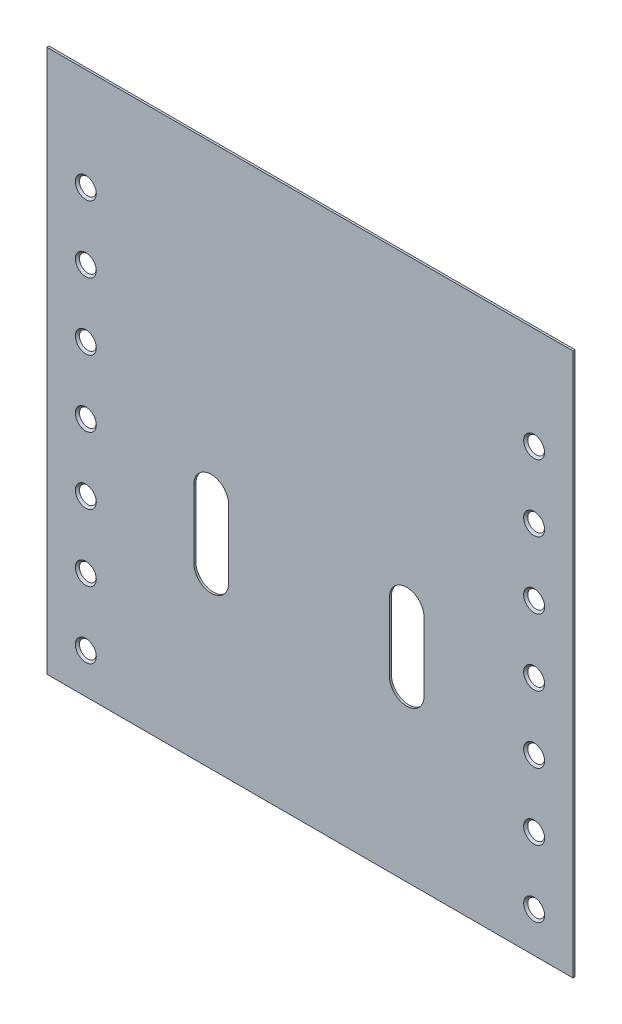
ISO-10303-21;
HEADER;
FILE_DESCRIPTION(('STEP AP214'),'2;1');
FILE_NAME('part.step','',(''),(''),'','','');
FILE_SCHEMA(('AUTOMOTIVE_DESIGN { 1 0 10303 214 1 1 1 1 }'));
ENDSEC;
DATA;
#1=APPLICATION_CONTEXT('core data for automotive mechanical design processes');
#2=APPLICATION_PROTOCOL_DEFINITION('international standard','automotive_design',2000,#1);
#3=PRODUCT_CONTEXT('',#1,'mechanical');
#4=PRODUCT('Part','Part','',(#3));
#5=PRODUCT_RELATED_PRODUCT_CATEGORY('part','',(#4));
#6=PRODUCT_DEFINITION_FORMATION('','',#4);
#7=PRODUCT_DEFINITION_CONTEXT('part definition',#1,'design');
#8=PRODUCT_DEFINITION('design','',#6,#7);
#9=PRODUCT_DEFINITION_SHAPE('','',#8);
#10=(LENGTH_UNIT() NAMED_UNIT(*) SI_UNIT(.MILLI.,.METRE.));
#11=(NAMED_UNIT(*) PLANE_ANGLE_UNIT() SI_UNIT($,.RADIAN.));
#12=(NAMED_UNIT(*) SI_UNIT($,.STERADIAN.) SOLID_ANGLE_UNIT());
#13=UNCERTAINTY_MEASURE_WITH_UNIT(LENGTH_MEASURE(1.E-05),#10,'distance_accuracy_value','');
#14=(GEOMETRIC_REPRESENTATION_CONTEXT(3) GLOBAL_UNCERTAINTY_ASSIGNED_CONTEXT((#13)) GLOBAL_UNIT_ASSIGNED_CONTEXT((#10,
#11,#12)) REPRESENTATION_CONTEXT('',''));
#15=CARTESIAN_POINT('',(0.,0.,0.));
#16=DIRECTION('',(0.,0.,1.));
#17=DIRECTION('',(1.,0.,0.));
#18=AXIS2_PLACEMENT_3D('',#15,#16,#17);
#19=CARTESIAN_POINT('',(0.,0.,-0.7747));
#20=DIRECTION('',(0.,0.,-1.));
#21=DIRECTION('',(-1.,0.,0.));
#22=AXIS2_PLACEMENT_3D('',#19,#20,#21);
#23=PLANE('',#22);
#24=CARTESIAN_POINT('',(-20.9050000000001,-222.,-0.7747));
#25=DIRECTION('',(0.,0.,-1.));
#26=DIRECTION('',(-1.,0.,0.));
#27=AXIS2_PLACEMENT_3D('',#24,#25,#26);
#28=CIRCLE('',#27,3.1373);
#29=CARTESIAN_POINT('',(-24.0423000000001,-222.,-0.7747));
#30=VERTEX_POINT('',#29);
#31=EDGE_CURVE('E38',#30,#30,#28,.T.);
#32=ORIENTED_EDGE('',*,*,#31,.F.);
#33=EDGE_LOOP('',(#32));
#34=FACE_BOUND('',#33,.T.);
#35=CARTESIAN_POINT('',(-20.9050000000003,-147.,-0.7747));
#36=DIRECTION('',(0.,0.,-1.));
#37=DIRECTION('',(-1.,0.,0.));
#38=AXIS2_PLACEMENT_3D('',#35,#36,#37);
#39=CIRCLE('',#38,3.1373);
#40=CARTESIAN_POINT('',(-24.0423000000003,-147.,-0.7747));
#41=VERTEX_POINT('',#40);
#42=EDGE_CURVE('E174',#41,#41,#39,.T.);
#43=ORIENTED_EDGE('',*,*,#42,.F.);
#44=EDGE_LOOP('',(#43));
#45=FACE_BOUND('',#44,.T.);
#46=CARTESIAN_POINT('',(-20.9050000000003,-71.9999999999999,-0.7747));
#47=DIRECTION('',(0.,0.,-1.));
#48=DIRECTION('',(-1.,0.,0.));
#49=AXIS2_PLACEMENT_3D('',#46,#47,#48);
#50=CIRCLE('',#49,3.1373);
#51=CARTESIAN_POINT('',(-24.0423000000003,-71.9999999999999,-0.7747));
#52=VERTEX_POINT('',#51);
#53=EDGE_CURVE('E199',#52,#52,#50,.T.);
#54=ORIENTED_EDGE('',*,*,#53,.F.);
#55=EDGE_LOOP('',(#54));
#56=FACE_BOUND('',#55,.T.);
#57=CARTESIAN_POINT('',(-188.645,-222.,-0.7747));
#58=DIRECTION('',(0.,0.,-1.));
#59=DIRECTION('',(-1.,0.,0.));
#60=AXIS2_PLACEMENT_3D('',#57,#58,#59);
#61=CIRCLE('',#60,3.1373);
#62=CARTESIAN_POINT('',(-191.7823,-222.,-0.7747));
#63=VERTEX_POINT('',#62);
#64=EDGE_CURVE('E205',#63,#63,#61,.T.);
#65=ORIENTED_EDGE('',*,*,#64,.F.);
#66=EDGE_LOOP('',(#65));
#67=FACE_BOUND('',#66,.T.);
#68=CARTESIAN_POINT('',(-188.645,-172.,-0.7747));
#69=DIRECTION('',(0.,0.,-1.));
#70=DIRECTION('',(-1.,0.,0.));
#71=AXIS2_PLACEMENT_3D('',#68,#69,#70);
#72=CIRCLE('',#71,3.1373);
#73=CARTESIAN_POINT('',(-191.7823,-172.,-0.7747));
#74=VERTEX_POINT('',#73);
#75=EDGE_CURVE('E217',#74,#74,#72,.T.);
#76=ORIENTED_EDGE('',*,*,#75,.F.);
#77=EDGE_LOOP('',(#76));
#78=FACE_BOUND('',#77,.T.);
#79=CARTESIAN_POINT('',(-188.645,-122.,-0.7747));
#80=DIRECTION('',(0.,0.,-1.));
#81=DIRECTION('',(-1.,0.,0.));
#82=AXIS2_PLACEMENT_3D('',#79,#80,#81);
#83=CIRCLE('',#82,3.1373);
#84=CARTESIAN_POINT('',(-191.7823,-122.,-0.7747));
#85=VERTEX_POINT('',#84);
#86=EDGE_CURVE('E229',#85,#85,#83,.T.);
#87=ORIENTED_EDGE('',*,*,#86,.F.);
#88=EDGE_LOOP('',(#87));
#89=FACE_BOUND('',#88,.T.);
#90=CARTESIAN_POINT('',(-188.645,-72.,-0.7747));
#91=DIRECTION('',(0.,0.,-1.));
#92=DIRECTION('',(-1.,0.,0.));
#93=AXIS2_PLACEMENT_3D('',#90,#91,#92);
#94=CIRCLE('',#93,3.1373);
#95=CARTESIAN_POINT('',(-191.7823,-72.,-0.7747));
#96=VERTEX_POINT('',#95);
#97=EDGE_CURVE('E143',#96,#96,#94,.T.);
#98=ORIENTED_EDGE('',*,*,#97,.F.);
#99=EDGE_LOOP('',(#98));
#100=FACE_BOUND('',#99,.T.);
#101=CARTESIAN_POINT('',(-68.5692532358968,-173.5,-0.774699999999979));
#102=DIRECTION('',(0.,0.,-1.));
#103=DIRECTION('',(0.,1.,0.));
#104=AXIS2_PLACEMENT_3D('',#101,#102,#103);
#105=CIRCLE('',#104,6.5);
#106=CARTESIAN_POINT('',(-62.0692532358968,-173.5,-0.774699999999979));
#107=VERTEX_POINT('',#106);
#108=CARTESIAN_POINT('',(-75.0692532358968,-173.5,-0.7747));
#109=VERTEX_POINT('',#108);
#110=EDGE_CURVE('E59',#107,#109,#105,.T.);
#111=ORIENTED_EDGE('',*,*,#110,.F.);
#112=DIRECTION('',(0.,-1.,0.));
#113=VECTOR('',#112,1.);
#114=CARTESIAN_POINT('',(-62.0692532358968,-173.5,-0.774699999999979));
#115=LINE('',#114,#113);
#116=CARTESIAN_POINT('',(-62.0692532358968,-148.,-0.774699999999982));
#117=VERTEX_POINT('',#116);
#118=EDGE_CURVE('E274',#117,#107,#115,.T.);
#119=ORIENTED_EDGE('',*,*,#118,.F.);
#120=CARTESIAN_POINT('',(-68.5692532358968,-148.,-0.774699999999982));
#121=DIRECTION('',(0.,0.,-1.));
#122=DIRECTION('',(0.,1.,0.));
#123=AXIS2_PLACEMENT_3D('',#120,#121,#122);
#124=CIRCLE('',#123,6.5);
#125=CARTESIAN_POINT('',(-75.0692532358968,-148.,-0.774699999999982));
#126=VERTEX_POINT('',#125);
#127=EDGE_CURVE('E288',#126,#117,#124,.T.);
#128=ORIENTED_EDGE('',*,*,#127,.F.);
#129=DIRECTION('',(0.,1.,0.));
#130=VECTOR('',#129,1.);
#131=CARTESIAN_POINT('',(-75.0692532358968,-173.5,-0.774699999999979));
#132=LINE('',#131,#130);
#133=EDGE_CURVE('E285',#109,#126,#132,.T.);
#134=ORIENTED_EDGE('',*,*,#133,.F.);
#135=EDGE_LOOP('',(#111,#119,#128,#134));
#136=FACE_BOUND('',#135,.T.);
#137=CARTESIAN_POINT('',(-141.721253235897,-173.5,-0.774699999999979));
#138=DIRECTION('',(0.,0.,-1.));
#139=DIRECTION('',(0.,1.,0.));
#140=AXIS2_PLACEMENT_3D('',#137,#138,#139);
#141=CIRCLE('',#140,6.49999999999995);
#142=CARTESIAN_POINT('',(-135.221253235897,-173.5,-0.774699999999979));
#143=VERTEX_POINT('',#142);
#144=CARTESIAN_POINT('',(-148.221253235897,-173.5,-0.7747));
#145=VERTEX_POINT('',#144);
#146=EDGE_CURVE('E51',#143,#145,#141,.T.);
#147=ORIENTED_EDGE('',*,*,#146,.F.);
#148=DIRECTION('',(0.,-1.,0.));
#149=VECTOR('',#148,1.);
#150=CARTESIAN_POINT('',(-135.221253235897,-173.5,-0.774699999999979));
#151=LINE('',#150,#149);
#152=CARTESIAN_POINT('',(-135.221253235897,-148.,-0.774699999999982));
#153=VERTEX_POINT('',#152);
#154=EDGE_CURVE('E244',#153,#143,#151,.T.);
#155=ORIENTED_EDGE('',*,*,#154,.F.);
#156=CARTESIAN_POINT('',(-141.721253235897,-148.,-0.774699999999982));
#157=DIRECTION('',(0.,0.,-1.));
#158=DIRECTION('',(0.,1.,0.));
#159=AXIS2_PLACEMENT_3D('',#156,#157,#158);
#160=CIRCLE('',#159,6.49999999999995);
#161=CARTESIAN_POINT('',(-148.221253235897,-148.,-0.774699999999982));
#162=VERTEX_POINT('',#161);
#163=EDGE_CURVE('E259',#162,#153,#160,.T.);
#164=ORIENTED_EDGE('',*,*,#163,.F.);
#165=DIRECTION('',(0.,1.,0.));
#166=VECTOR('',#165,1.);
#167=CARTESIAN_POINT('',(-148.221253235897,-173.5,-0.774699999999979));
#168=LINE('',#167,#166);
#169=EDGE_CURVE('E255',#145,#162,#168,.T.);
#170=ORIENTED_EDGE('',*,*,#169,.F.);
#171=EDGE_LOOP('',(#147,#155,#164,#170));
#172=FACE_BOUND('',#171,.T.);
#173=DIRECTION('',(0.,1.,0.));
#174=VECTOR('',#173,1.);
#175=CARTESIAN_POINT('',(-203.2,-237.,-0.7747));
#176=LINE('',#175,#174);
#177=CARTESIAN_POINT('',(-203.2,-237.,-0.7747));
#178=VERTEX_POINT('',#177);
#179=CARTESIAN_POINT('',(-203.2,-33.7999999999999,-0.7747));
#180=VERTEX_POINT('',#179);
#181=EDGE_CURVE('E151',#178,#180,#176,.T.);
#182=ORIENTED_EDGE('',*,*,#181,.T.);
#183=DIRECTION('',(1.,0.,0.));
#184=VECTOR('',#183,1.);
#185=CARTESIAN_POINT('',(-203.2,-33.7999999999999,-0.7747));
#186=LINE('',#185,#184);
#187=CARTESIAN_POINT('',(-6.35000000000006,-33.8,-0.7747));
#188=VERTEX_POINT('',#187);
#189=EDGE_CURVE('E147',#180,#188,#186,.T.);
#190=ORIENTED_EDGE('',*,*,#189,.T.);
#191=DIRECTION('',(0.,-1.,0.));
#192=VECTOR('',#191,1.);
#193=CARTESIAN_POINT('',(-6.35000000000001,-237.,-0.7747));
#194=LINE('',#193,#192);
#195=CARTESIAN_POINT('',(-6.35000000000001,-237.,-0.7747));
#196=VERTEX_POINT('',#195);
#197=EDGE_CURVE('E150',#188,#196,#194,.T.);
#198=ORIENTED_EDGE('',*,*,#197,.T.);
#199=DIRECTION('',(-1.,0.,0.));
#200=VECTOR('',#199,1.);
#201=CARTESIAN_POINT('',(-203.2,-237.,-0.7747));
#202=LINE('',#201,#200);
#203=EDGE_CURVE('E153',#196,#178,#202,.T.);
#204=ORIENTED_EDGE('',*,*,#203,.T.);
#205=EDGE_LOOP('',(#182,#190,#198,#204));
#206=FACE_BOUND('',#205,.T.);
#207=CARTESIAN_POINT('',(-188.645,-96.9999999999999,-0.7747));
#208=DIRECTION('',(0.,0.,-1.));
#209=DIRECTION('',(-1.,0.,0.));
#210=AXIS2_PLACEMENT_3D('',#207,#208,#209);
#211=CIRCLE('',#210,3.1373);
#212=CARTESIAN_POINT('',(-191.7823,-96.9999999999999,-0.7747));
#213=VERTEX_POINT('',#212);
#214=EDGE_CURVE('E235',#213,#213,#211,.T.);
#215=ORIENTED_EDGE('',*,*,#214,.F.);
#216=EDGE_LOOP('',(#215));
#217=FACE_BOUND('',#216,.T.);
#218=CARTESIAN_POINT('',(-188.645,-147.,-0.7747));
#219=DIRECTION('',(0.,0.,-1.));
#220=DIRECTION('',(-1.,0.,0.));
#221=AXIS2_PLACEMENT_3D('',#218,#219,#220);
#222=CIRCLE('',#221,3.1373);
#223=CARTESIAN_POINT('',(-191.7823,-147.,-0.7747));
#224=VERTEX_POINT('',#223);
#225=EDGE_CURVE('E223',#224,#224,#222,.T.);
#226=ORIENTED_EDGE('',*,*,#225,.F.);
#227=EDGE_LOOP('',(#226));
#228=FACE_BOUND('',#227,.T.);
#229=CARTESIAN_POINT('',(-188.645,-197.,-0.7747));
#230=DIRECTION('',(0.,0.,-1.));
#231=DIRECTION('',(-1.,0.,0.));
#232=AXIS2_PLACEMENT_3D('',#229,#230,#231);
#233=CIRCLE('',#232,3.1373);
#234=CARTESIAN_POINT('',(-191.7823,-197.,-0.7747));
#235=VERTEX_POINT('',#234);
#236=EDGE_CURVE('E211',#235,#235,#233,.T.);
#237=ORIENTED_EDGE('',*,*,#236,.F.);
#238=EDGE_LOOP('',(#237));
#239=FACE_BOUND('',#238,.T.);
#240=CARTESIAN_POINT('',(-20.9050000000003,-96.9999999999999,-0.7747));
#241=DIRECTION('',(0.,0.,-1.));
#242=DIRECTION('',(-1.,0.,0.));
#243=AXIS2_PLACEMENT_3D('',#240,#241,#242);
#244=CIRCLE('',#243,3.1373);
#245=CARTESIAN_POINT('',(-24.0423000000003,-96.9999999999999,-0.7747));
#246=VERTEX_POINT('',#245);
#247=EDGE_CURVE('E170',#246,#246,#244,.T.);
#248=ORIENTED_EDGE('',*,*,#247,.F.);
#249=EDGE_LOOP('',(#248));
#250=FACE_BOUND('',#249,.T.);
#251=CARTESIAN_POINT('',(-20.9050000000003,-122.,-0.7747));
#252=DIRECTION('',(0.,0.,-1.));
#253=DIRECTION('',(-1.,0.,0.));
#254=AXIS2_PLACEMENT_3D('',#251,#252,#253);
#255=CIRCLE('',#254,3.1373);
#256=CARTESIAN_POINT('',(-24.0423000000003,-122.,-0.7747));
#257=VERTEX_POINT('',#256);
#258=EDGE_CURVE('E181',#257,#257,#255,.T.);
#259=ORIENTED_EDGE('',*,*,#258,.F.);
#260=EDGE_LOOP('',(#259));
#261=FACE_BOUND('',#260,.T.);
#262=CARTESIAN_POINT('',(-20.9050000000003,-172.,-0.7747));
#263=DIRECTION('',(0.,0.,-1.));
#264=DIRECTION('',(-1.,0.,0.));
#265=AXIS2_PLACEMENT_3D('',#262,#263,#264);
#266=CIRCLE('',#265,3.1373);
#267=CARTESIAN_POINT('',(-24.0423000000003,-172.,-0.7747));
#268=VERTEX_POINT('',#267);
#269=EDGE_CURVE('E184',#268,#268,#266,.T.);
#270=ORIENTED_EDGE('',*,*,#269,.F.);
#271=EDGE_LOOP('',(#270));
#272=FACE_BOUND('',#271,.T.);
#273=CARTESIAN_POINT('',(-20.9050000000003,-197.,-0.7747));
#274=DIRECTION('',(0.,0.,-1.));
#275=DIRECTION('',(-1.,0.,0.));
#276=AXIS2_PLACEMENT_3D('',#273,#274,#275);
#277=CIRCLE('',#276,3.1373);
#278=CARTESIAN_POINT('',(-24.0423000000003,-197.,-0.7747));
#279=VERTEX_POINT('',#278);
#280=EDGE_CURVE('E613',#279,#279,#277,.T.);
#281=ORIENTED_EDGE('',*,*,#280,.F.);
#282=EDGE_LOOP('',(#281));
#283=FACE_BOUND('',#282,.T.);
#284=ADVANCED_FACE('F34',(#34,#45,#56,#67,#78,#89,#100,#136,#172,#206,#217,#228,#239,#250,#261,
#272,#283),#23,.T.);
#285=CARTESIAN_POINT('',(0.,0.,0.));
#286=DIRECTION('',(0.,0.,-1.));
#287=DIRECTION('',(-1.,0.,0.));
#288=AXIS2_PLACEMENT_3D('',#285,#286,#287);
#289=PLANE('',#288);
#290=CARTESIAN_POINT('',(-20.9050000000001,-222.,0.));
#291=DIRECTION('',(0.,0.,1.));
#292=DIRECTION('',(1.,0.,0.));
#293=AXIS2_PLACEMENT_3D('',#290,#291,#292);
#294=CIRCLE('',#293,3.912);
#295=CARTESIAN_POINT('',(-16.9930000000001,-222.,0.));
#296=VERTEX_POINT('',#295);
#297=EDGE_CURVE('E620',#296,#296,#294,.T.);
#298=ORIENTED_EDGE('',*,*,#297,.F.);
#299=EDGE_LOOP('',(#298));
#300=FACE_BOUND('',#299,.T.);
#301=CARTESIAN_POINT('',(-20.9050000000003,-147.,0.));
#302=DIRECTION('',(0.,0.,1.));
#303=DIRECTION('',(1.,0.,0.));
#304=AXIS2_PLACEMENT_3D('',#301,#302,#303);
#305=CIRCLE('',#304,3.912);
#306=CARTESIAN_POINT('',(-16.9930000000003,-147.,0.));
#307=VERTEX_POINT('',#306);
#308=EDGE_CURVE('E177',#307,#307,#305,.T.);
#309=ORIENTED_EDGE('',*,*,#308,.F.);
#310=EDGE_LOOP('',(#309));
#311=FACE_BOUND('',#310,.T.);
#312=CARTESIAN_POINT('',(-20.9050000000003,-96.9999999999999,0.));
#313=DIRECTION('',(0.,0.,1.));
#314=DIRECTION('',(1.,0.,0.));
#315=AXIS2_PLACEMENT_3D('',#312,#313,#314);
#316=CIRCLE('',#315,3.912);
#317=CARTESIAN_POINT('',(-16.9930000000003,-96.9999999999999,0.));
#318=VERTEX_POINT('',#317);
#319=EDGE_CURVE('E173',#318,#318,#316,.T.);
#320=ORIENTED_EDGE('',*,*,#319,.F.);
#321=EDGE_LOOP('',(#320));
#322=FACE_BOUND('',#321,.T.);
#323=CARTESIAN_POINT('',(-188.645,-222.,0.));
#324=DIRECTION('',(0.,0.,1.));
#325=DIRECTION('',(1.,0.,0.));
#326=AXIS2_PLACEMENT_3D('',#323,#324,#325);
#327=CIRCLE('',#326,3.912);
#328=CARTESIAN_POINT('',(-184.733,-222.,0.));
#329=VERTEX_POINT('',#328);
#330=EDGE_CURVE('E202',#329,#329,#327,.T.);
#331=ORIENTED_EDGE('',*,*,#330,.F.);
#332=EDGE_LOOP('',(#331));
#333=FACE_BOUND('',#332,.T.);
#334=CARTESIAN_POINT('',(-188.645,-197.,0.));
#335=DIRECTION('',(0.,0.,1.));
#336=DIRECTION('',(1.,0.,0.));
#337=AXIS2_PLACEMENT_3D('',#334,#335,#336);
#338=CIRCLE('',#337,3.912);
#339=CARTESIAN_POINT('',(-184.733,-197.,0.));
#340=VERTEX_POINT('',#339);
#341=EDGE_CURVE('E208',#340,#340,#338,.T.);
#342=ORIENTED_EDGE('',*,*,#341,.F.);
#343=EDGE_LOOP('',(#342));
#344=FACE_BOUND('',#343,.T.);
#345=CARTESIAN_POINT('',(-188.645,-172.,0.));
#346=DIRECTION('',(0.,0.,1.));
#347=DIRECTION('',(1.,0.,0.));
#348=AXIS2_PLACEMENT_3D('',#345,#346,#347);
#349=CIRCLE('',#348,3.912);
#350=CARTESIAN_POINT('',(-184.733,-172.,0.));
#351=VERTEX_POINT('',#350);
#352=EDGE_CURVE('E214',#351,#351,#349,.T.);
#353=ORIENTED_EDGE('',*,*,#352,.F.);
#354=EDGE_LOOP('',(#353));
#355=FACE_BOUND('',#354,.T.);
#356=CARTESIAN_POINT('',(-188.645,-147.,0.));
#357=DIRECTION('',(0.,0.,1.));
#358=DIRECTION('',(1.,0.,0.));
#359=AXIS2_PLACEMENT_3D('',#356,#357,#358);
#360=CIRCLE('',#359,3.912);
#361=CARTESIAN_POINT('',(-184.733,-147.,0.));
#362=VERTEX_POINT('',#361);
#363=EDGE_CURVE('E220',#362,#362,#360,.T.);
#364=ORIENTED_EDGE('',*,*,#363,.F.);
#365=EDGE_LOOP('',(#364));
#366=FACE_BOUND('',#365,.T.);
#367=CARTESIAN_POINT('',(-188.645,-122.,0.));
#368=DIRECTION('',(0.,0.,1.));
#369=DIRECTION('',(1.,0.,0.));
#370=AXIS2_PLACEMENT_3D('',#367,#368,#369);
#371=CIRCLE('',#370,3.912);
#372=CARTESIAN_POINT('',(-184.733,-122.,0.));
#373=VERTEX_POINT('',#372);
#374=EDGE_CURVE('E226',#373,#373,#371,.T.);
#375=ORIENTED_EDGE('',*,*,#374,.F.);
#376=EDGE_LOOP('',(#375));
#377=FACE_BOUND('',#376,.T.);
#378=CARTESIAN_POINT('',(-188.645,-96.9999999999999,0.));
#379=DIRECTION('',(0.,0.,1.));
#380=DIRECTION('',(1.,0.,0.));
#381=AXIS2_PLACEMENT_3D('',#378,#379,#380);
#382=CIRCLE('',#381,3.912);
#383=CARTESIAN_POINT('',(-184.733,-96.9999999999999,0.));
#384=VERTEX_POINT('',#383);
#385=EDGE_CURVE('E232',#384,#384,#382,.T.);
#386=ORIENTED_EDGE('',*,*,#385,.F.);
#387=EDGE_LOOP('',(#386));
#388=FACE_BOUND('',#387,.T.);
#389=CARTESIAN_POINT('',(-188.645,-72.,0.));
#390=DIRECTION('',(0.,0.,1.));
#391=DIRECTION('',(1.,0.,0.));
#392=AXIS2_PLACEMENT_3D('',#389,#390,#391);
#393=CIRCLE('',#392,3.912);
#394=CARTESIAN_POINT('',(-184.733,-72.,0.));
#395=VERTEX_POINT('',#394);
#396=EDGE_CURVE('E169',#395,#395,#393,.T.);
#397=ORIENTED_EDGE('',*,*,#396,.F.);
#398=EDGE_LOOP('',(#397));
#399=FACE_BOUND('',#398,.T.);
#400=DIRECTION('',(0.,-1.,0.));
#401=VECTOR('',#400,1.);
#402=CARTESIAN_POINT('',(-62.0692532358968,-173.5,0.));
#403=LINE('',#402,#401);
#404=CARTESIAN_POINT('',(-62.0692532358968,-148.,0.));
#405=VERTEX_POINT('',#404);
#406=CARTESIAN_POINT('',(-62.0692532358968,-173.5,0.));
#407=VERTEX_POINT('',#406);
#408=EDGE_CURVE('E280',#405,#407,#403,.T.);
#409=ORIENTED_EDGE('',*,*,#408,.T.);
#410=CARTESIAN_POINT('',(-68.5692532358968,-173.5,0.));
#411=DIRECTION('',(0.,0.,-1.));
#412=DIRECTION('',(0.,1.,0.));
#413=AXIS2_PLACEMENT_3D('',#410,#411,#412);
#414=CIRCLE('',#413,6.5);
#415=CARTESIAN_POINT('',(-75.0692532358968,-173.5,0.));
#416=VERTEX_POINT('',#415);
#417=EDGE_CURVE('E270',#407,#416,#414,.T.);
#418=ORIENTED_EDGE('',*,*,#417,.T.);
#419=DIRECTION('',(0.,1.,0.));
#420=VECTOR('',#419,1.);
#421=CARTESIAN_POINT('',(-75.0692532358968,-173.5,0.));
#422=LINE('',#421,#420);
#423=CARTESIAN_POINT('',(-75.0692532358968,-148.,0.));
#424=VERTEX_POINT('',#423);
#425=EDGE_CURVE('E273',#416,#424,#422,.T.);
#426=ORIENTED_EDGE('',*,*,#425,.T.);
#427=CARTESIAN_POINT('',(-68.5692532358968,-148.,0.));
#428=DIRECTION('',(0.,0.,-1.));
#429=DIRECTION('',(0.,1.,0.));
#430=AXIS2_PLACEMENT_3D('',#427,#428,#429);
#431=CIRCLE('',#430,6.5);
#432=EDGE_CURVE('E277',#424,#405,#431,.T.);
#433=ORIENTED_EDGE('',*,*,#432,.T.);
#434=EDGE_LOOP('',(#409,#418,#426,#433));
#435=FACE_BOUND('',#434,.T.);
#436=DIRECTION('',(0.,-1.,0.));
#437=VECTOR('',#436,1.);
#438=CARTESIAN_POINT('',(-135.221253235897,-173.5,0.));
#439=LINE('',#438,#437);
#440=CARTESIAN_POINT('',(-135.221253235897,-148.,0.));
#441=VERTEX_POINT('',#440);
#442=CARTESIAN_POINT('',(-135.221253235897,-173.5,0.));
#443=VERTEX_POINT('',#442);
#444=EDGE_CURVE('E250',#441,#443,#439,.T.);
#445=ORIENTED_EDGE('',*,*,#444,.T.);
#446=CARTESIAN_POINT('',(-141.721253235897,-173.5,0.));
#447=DIRECTION('',(0.,0.,-1.));
#448=DIRECTION('',(0.,1.,0.));
#449=AXIS2_PLACEMENT_3D('',#446,#447,#448);
#450=CIRCLE('',#449,6.49999999999995);
#451=CARTESIAN_POINT('',(-148.221253235897,-173.5,0.));
#452=VERTEX_POINT('',#451);
#453=EDGE_CURVE('E240',#443,#452,#450,.T.);
#454=ORIENTED_EDGE('',*,*,#453,.T.);
#455=DIRECTION('',(0.,1.,0.));
#456=VECTOR('',#455,1.);
#457=CARTESIAN_POINT('',(-148.221253235897,-173.5,0.));
#458=LINE('',#457,#456);
#459=CARTESIAN_POINT('',(-148.221253235897,-148.,0.));
#460=VERTEX_POINT('',#459);
#461=EDGE_CURVE('E243',#452,#460,#458,.T.);
#462=ORIENTED_EDGE('',*,*,#461,.T.);
#463=CARTESIAN_POINT('',(-141.721253235897,-148.,0.));
#464=DIRECTION('',(0.,0.,-1.));
#465=DIRECTION('',(0.,1.,0.));
#466=AXIS2_PLACEMENT_3D('',#463,#464,#465);
#467=CIRCLE('',#466,6.49999999999995);
#468=EDGE_CURVE('E247',#460,#441,#467,.T.);
#469=ORIENTED_EDGE('',*,*,#468,.T.);
#470=EDGE_LOOP('',(#445,#454,#462,#469));
#471=FACE_BOUND('',#470,.T.);
#472=DIRECTION('',(-1.,0.,0.));
#473=VECTOR('',#472,1.);
#474=CARTESIAN_POINT('',(-203.2,-237.,0.));
#475=LINE('',#474,#473);
#476=CARTESIAN_POINT('',(-6.35000000000001,-237.,0.));
#477=VERTEX_POINT('',#476);
#478=CARTESIAN_POINT('',(-203.2,-237.,0.));
#479=VERTEX_POINT('',#478);
#480=EDGE_CURVE('E155',#477,#479,#475,.T.);
#481=ORIENTED_EDGE('',*,*,#480,.F.);
#482=DIRECTION('',(0.,-1.,0.));
#483=VECTOR('',#482,1.);
#484=CARTESIAN_POINT('',(-6.35000000000001,-237.,0.));
#485=LINE('',#484,#483);
#486=CARTESIAN_POINT('',(-6.35000000000006,-33.7999999999999,0.));
#487=VERTEX_POINT('',#486);
#488=EDGE_CURVE('E133',#487,#477,#485,.T.);
#489=ORIENTED_EDGE('',*,*,#488,.F.);
#490=DIRECTION('',(-1.,0.,0.));
#491=VECTOR('',#490,1.);
#492=CARTESIAN_POINT('',(-6.35000000000006,-33.7999999999999,0.));
#493=LINE('',#492,#491);
#494=CARTESIAN_POINT('',(-203.2,-33.8,0.));
#495=VERTEX_POINT('',#494);
#496=EDGE_CURVE('E137',#487,#495,#493,.T.);
#497=ORIENTED_EDGE('',*,*,#496,.T.);
#498=DIRECTION('',(0.,1.,0.));
#499=VECTOR('',#498,1.);
#500=CARTESIAN_POINT('',(-203.2,-237.,0.));
#501=LINE('',#500,#499);
#502=EDGE_CURVE('E126',#479,#495,#501,.T.);
#503=ORIENTED_EDGE('',*,*,#502,.F.);
#504=EDGE_LOOP('',(#481,#489,#497,#503));
#505=FACE_BOUND('',#504,.T.);
#506=CARTESIAN_POINT('',(-20.9050000000003,-71.9999999999999,0.));
#507=DIRECTION('',(0.,0.,1.));
#508=DIRECTION('',(1.,0.,0.));
#509=AXIS2_PLACEMENT_3D('',#506,#507,#508);
#510=CIRCLE('',#509,3.912);
#511=CARTESIAN_POINT('',(-16.9930000000003,-71.9999999999999,0.));
#512=VERTEX_POINT('',#511);
#513=EDGE_CURVE('E172',#512,#512,#510,.T.);
#514=ORIENTED_EDGE('',*,*,#513,.F.);
#515=EDGE_LOOP('',(#514));
#516=FACE_BOUND('',#515,.T.);
#517=CARTESIAN_POINT('',(-20.9050000000003,-122.,0.));
#518=DIRECTION('',(0.,0.,1.));
#519=DIRECTION('',(1.,0.,0.));
#520=AXIS2_PLACEMENT_3D('',#517,#518,#519);
#521=CIRCLE('',#520,3.912);
#522=CARTESIAN_POINT('',(-16.9930000000003,-122.,0.));
#523=VERTEX_POINT('',#522);
#524=EDGE_CURVE('E176',#523,#523,#521,.T.);
#525=ORIENTED_EDGE('',*,*,#524,.F.);
#526=EDGE_LOOP('',(#525));
#527=FACE_BOUND('',#526,.T.);
#528=CARTESIAN_POINT('',(-20.9050000000003,-172.,0.));
#529=DIRECTION('',(0.,0.,1.));
#530=DIRECTION('',(1.,0.,0.));
#531=AXIS2_PLACEMENT_3D('',#528,#529,#530);
#532=CIRCLE('',#531,3.912);
#533=CARTESIAN_POINT('',(-16.9930000000003,-172.,0.));
#534=VERTEX_POINT('',#533);
#535=EDGE_CURVE('E189',#534,#534,#532,.T.);
#536=ORIENTED_EDGE('',*,*,#535,.F.);
#537=EDGE_LOOP('',(#536));
#538=FACE_BOUND('',#537,.T.);
#539=CARTESIAN_POINT('',(-20.9050000000003,-197.,0.));
#540=DIRECTION('',(0.,0.,1.));
#541=DIRECTION('',(1.,0.,0.));
#542=AXIS2_PLACEMENT_3D('',#539,#540,#541);
#543=CIRCLE('',#542,3.912);
#544=CARTESIAN_POINT('',(-16.9930000000003,-197.,0.));
#545=VERTEX_POINT('',#544);
#546=EDGE_CURVE('E614',#545,#545,#543,.T.);
#547=ORIENTED_EDGE('',*,*,#546,.F.);
#548=EDGE_LOOP('',(#547));
#549=FACE_BOUND('',#548,.T.);
#550=ADVANCED_FACE('F138',(#300,#311,#322,#333,#344,#355,#366,#377,#388,#399,#435,#471,#505,
#516,#527,#538,#549),#289,.F.);
#551=CARTESIAN_POINT('',(-203.2,-237.,-0.7747));
#552=DIRECTION('',(1.,0.,0.));
#553=DIRECTION('',(0.,1.,0.));
#554=AXIS2_PLACEMENT_3D('',#551,#552,#553);
#555=PLANE('',#554);
#556=ORIENTED_EDGE('',*,*,#502,.T.);
#557=DIRECTION('',(0.,0.,1.));
#558=VECTOR('',#557,1.);
#559=CARTESIAN_POINT('',(-203.2,-33.7999999999999,-0.7747));
#560=LINE('',#559,#558);
#561=EDGE_CURVE('E11',#180,#495,#560,.T.);
#562=ORIENTED_EDGE('',*,*,#561,.F.);
#563=ORIENTED_EDGE('',*,*,#181,.F.);
#564=DIRECTION('',(0.,0.,1.));
#565=VECTOR('',#564,1.);
#566=CARTESIAN_POINT('',(-203.2,-237.,-0.7747));
#567=LINE('',#566,#565);
#568=EDGE_CURVE('E130',#178,#479,#567,.T.);
#569=ORIENTED_EDGE('',*,*,#568,.T.);
#570=EDGE_LOOP('',(#556,#562,#563,#569));
#571=FACE_BOUND('',#570,.T.);
#572=ADVANCED_FACE('F36',(#571),#555,.F.);
#573=CARTESIAN_POINT('',(-203.2,-33.7999999999999,-0.7747));
#574=DIRECTION('',(0.,-1.,0.));
#575=DIRECTION('',(1.,0.,0.));
#576=AXIS2_PLACEMENT_3D('',#573,#574,#575);
#577=PLANE('',#576);
#578=ORIENTED_EDGE('',*,*,#561,.T.);
#579=ORIENTED_EDGE('',*,*,#496,.F.);
#580=DIRECTION('',(0.,0.,1.));
#581=VECTOR('',#580,1.);
#582=CARTESIAN_POINT('',(-6.35000000000006,-33.8,-0.7747));
#583=LINE('',#582,#581);
#584=EDGE_CURVE('E43',#188,#487,#583,.T.);
#585=ORIENTED_EDGE('',*,*,#584,.F.);
#586=ORIENTED_EDGE('',*,*,#189,.F.);
#587=EDGE_LOOP('',(#578,#579,#585,#586));
#588=FACE_BOUND('',#587,.T.);
#589=ADVANCED_FACE('F146',(#588),#577,.F.);
#590=CARTESIAN_POINT('',(-6.35000000000001,-237.,-0.7747));
#591=DIRECTION('',(-1.,0.,0.));
#592=DIRECTION('',(0.,-1.,0.));
#593=AXIS2_PLACEMENT_3D('',#590,#591,#592);
#594=PLANE('',#593);
#595=ORIENTED_EDGE('',*,*,#584,.T.);
#596=ORIENTED_EDGE('',*,*,#488,.T.);
#597=DIRECTION('',(0.,0.,1.));
#598=VECTOR('',#597,1.);
#599=CARTESIAN_POINT('',(-6.35000000000001,-237.,-0.7747));
#600=LINE('',#599,#598);
#601=EDGE_CURVE('E163',#196,#477,#600,.T.);
#602=ORIENTED_EDGE('',*,*,#601,.F.);
#603=ORIENTED_EDGE('',*,*,#197,.F.);
#604=EDGE_LOOP('',(#595,#596,#602,#603));
#605=FACE_BOUND('',#604,.T.);
#606=ADVANCED_FACE('F339',(#605),#594,.F.);
#607=CARTESIAN_POINT('',(-203.2,-237.,-0.7747));
#608=DIRECTION('',(0.,1.,0.));
#609=DIRECTION('',(0.,0.,1.));
#610=AXIS2_PLACEMENT_3D('',#607,#608,#609);
#611=PLANE('',#610);
#612=ORIENTED_EDGE('',*,*,#480,.T.);
#613=ORIENTED_EDGE('',*,*,#568,.F.);
#614=ORIENTED_EDGE('',*,*,#203,.F.);
#615=ORIENTED_EDGE('',*,*,#601,.T.);
#616=EDGE_LOOP('',(#612,#613,#614,#615));
#617=FACE_BOUND('',#616,.T.);
#618=ADVANCED_FACE('F322',(#617),#611,.F.);
#619=CARTESIAN_POINT('',(-68.5692532358968,-173.5,0.));
#620=DIRECTION('',(0.,0.,-1.));
#621=DIRECTION('',(0.,1.,0.));
#622=AXIS2_PLACEMENT_3D('',#619,#620,#621);
#623=CYLINDRICAL_SURFACE('',#622,6.5);
#624=ORIENTED_EDGE('',*,*,#110,.T.);
#625=DIRECTION('',(0.,0.,-1.));
#626=VECTOR('',#625,1.);
#627=CARTESIAN_POINT('',(-75.0692532358968,-173.5,0.));
#628=LINE('',#627,#626);
#629=EDGE_CURVE('E283',#416,#109,#628,.T.);
#630=ORIENTED_EDGE('',*,*,#629,.F.);
#631=ORIENTED_EDGE('',*,*,#417,.F.);
#632=DIRECTION('',(0.,0.,-1.));
#633=VECTOR('',#632,1.);
#634=CARTESIAN_POINT('',(-62.0692532358968,-173.5,0.));
#635=LINE('',#634,#633);
#636=EDGE_CURVE('E256',#407,#107,#635,.T.);
#637=ORIENTED_EDGE('',*,*,#636,.T.);
#638=EDGE_LOOP('',(#624,#630,#631,#637));
#639=FACE_BOUND('',#638,.T.);
#640=ADVANCED_FACE('F312',(#639),#623,.F.);
#641=CARTESIAN_POINT('',(-62.0692532358968,-173.5,0.));
#642=DIRECTION('',(1.,0.,0.));
#643=DIRECTION('',(0.,1.,0.));
#644=AXIS2_PLACEMENT_3D('',#641,#642,#643);
#645=PLANE('',#644);
#646=ORIENTED_EDGE('',*,*,#118,.T.);
#647=ORIENTED_EDGE('',*,*,#636,.F.);
#648=ORIENTED_EDGE('',*,*,#408,.F.);
#649=DIRECTION('',(0.,0.,-1.));
#650=VECTOR('',#649,1.);
#651=CARTESIAN_POINT('',(-62.0692532358968,-148.,0.));
#652=LINE('',#651,#650);
#653=EDGE_CURVE('E294',#405,#117,#652,.T.);
#654=ORIENTED_EDGE('',*,*,#653,.T.);
#655=EDGE_LOOP('',(#646,#647,#648,#654));
#656=FACE_BOUND('',#655,.T.);
#657=ADVANCED_FACE('F314',(#656),#645,.F.);
#658=CARTESIAN_POINT('',(-68.5692532358968,-148.,0.));
#659=DIRECTION('',(0.,0.,-1.));
#660=DIRECTION('',(0.,1.,0.));
#661=AXIS2_PLACEMENT_3D('',#658,#659,#660);
#662=CYLINDRICAL_SURFACE('',#661,6.5);
#663=ORIENTED_EDGE('',*,*,#127,.T.);
#664=ORIENTED_EDGE('',*,*,#653,.F.);
#665=ORIENTED_EDGE('',*,*,#432,.F.);
#666=DIRECTION('',(0.,0.,-1.));
#667=VECTOR('',#666,1.);
#668=CARTESIAN_POINT('',(-75.0692532358968,-148.,0.));
#669=LINE('',#668,#667);
#670=EDGE_CURVE('E296',#424,#126,#669,.T.);
#671=ORIENTED_EDGE('',*,*,#670,.T.);
#672=EDGE_LOOP('',(#663,#664,#665,#671));
#673=FACE_BOUND('',#672,.T.);
#674=ADVANCED_FACE('F308',(#673),#662,.F.);
#675=CARTESIAN_POINT('',(-75.0692532358968,-173.5,0.));
#676=DIRECTION('',(-1.,0.,0.));
#677=DIRECTION('',(0.,-1.,0.));
#678=AXIS2_PLACEMENT_3D('',#675,#676,#677);
#679=PLANE('',#678);
#680=ORIENTED_EDGE('',*,*,#133,.T.);
#681=ORIENTED_EDGE('',*,*,#670,.F.);
#682=ORIENTED_EDGE('',*,*,#425,.F.);
#683=ORIENTED_EDGE('',*,*,#629,.T.);
#684=EDGE_LOOP('',(#680,#681,#682,#683));
#685=FACE_BOUND('',#684,.T.);
#686=ADVANCED_FACE('F300',(#685),#679,.F.);
#687=CARTESIAN_POINT('',(-141.721253235897,-173.5,0.));
#688=DIRECTION('',(0.,0.,-1.));
#689=DIRECTION('',(0.,1.,0.));
#690=AXIS2_PLACEMENT_3D('',#687,#688,#689);
#691=CYLINDRICAL_SURFACE('',#690,6.49999999999995);
#692=ORIENTED_EDGE('',*,*,#146,.T.);
#693=DIRECTION('',(0.,0.,-1.));
#694=VECTOR('',#693,1.);
#695=CARTESIAN_POINT('',(-148.221253235897,-173.5,0.));
#696=LINE('',#695,#694);
#697=EDGE_CURVE('E253',#452,#145,#696,.T.);
#698=ORIENTED_EDGE('',*,*,#697,.F.);
#699=ORIENTED_EDGE('',*,*,#453,.F.);
#700=DIRECTION('',(0.,0.,-1.));
#701=VECTOR('',#700,1.);
#702=CARTESIAN_POINT('',(-135.221253235897,-173.5,0.));
#703=LINE('',#702,#701);
#704=EDGE_CURVE('E134',#443,#143,#703,.T.);
#705=ORIENTED_EDGE('',*,*,#704,.T.);
#706=EDGE_LOOP('',(#692,#698,#699,#705));
#707=FACE_BOUND('',#706,.T.);
#708=ADVANCED_FACE('F467',(#707),#691,.F.);
#709=CARTESIAN_POINT('',(-135.221253235897,-173.5,0.));
#710=DIRECTION('',(1.,0.,0.));
#711=DIRECTION('',(0.,0.,-1.));
#712=AXIS2_PLACEMENT_3D('',#709,#710,#711);
#713=PLANE('',#712);
#714=ORIENTED_EDGE('',*,*,#154,.T.);
#715=ORIENTED_EDGE('',*,*,#704,.F.);
#716=ORIENTED_EDGE('',*,*,#444,.F.);
#717=DIRECTION('',(0.,0.,-1.));
#718=VECTOR('',#717,1.);
#719=CARTESIAN_POINT('',(-135.221253235897,-148.,0.));
#720=LINE('',#719,#718);
#721=EDGE_CURVE('E265',#441,#153,#720,.T.);
#722=ORIENTED_EDGE('',*,*,#721,.T.);
#723=EDGE_LOOP('',(#714,#715,#716,#722));
#724=FACE_BOUND('',#723,.T.);
#725=ADVANCED_FACE('F463',(#724),#713,.F.);
#726=CARTESIAN_POINT('',(-141.721253235897,-148.,0.));
#727=DIRECTION('',(0.,0.,-1.));
#728=DIRECTION('',(0.,1.,0.));
#729=AXIS2_PLACEMENT_3D('',#726,#727,#728);
#730=CYLINDRICAL_SURFACE('',#729,6.49999999999995);
#731=ORIENTED_EDGE('',*,*,#163,.T.);
#732=ORIENTED_EDGE('',*,*,#721,.F.);
#733=ORIENTED_EDGE('',*,*,#468,.F.);
#734=DIRECTION('',(0.,0.,-1.));
#735=VECTOR('',#734,1.);
#736=CARTESIAN_POINT('',(-148.221253235897,-148.,0.));
#737=LINE('',#736,#735);
#738=EDGE_CURVE('E267',#460,#162,#737,.T.);
#739=ORIENTED_EDGE('',*,*,#738,.T.);
#740=EDGE_LOOP('',(#731,#732,#733,#739));
#741=FACE_BOUND('',#740,.T.);
#742=ADVANCED_FACE('F466',(#741),#730,.F.);
#743=CARTESIAN_POINT('',(-148.221253235897,-173.5,0.));
#744=DIRECTION('',(-1.,0.,0.));
#745=DIRECTION('',(0.,0.,1.));
#746=AXIS2_PLACEMENT_3D('',#743,#744,#745);
#747=PLANE('',#746);
#748=ORIENTED_EDGE('',*,*,#169,.T.);
#749=ORIENTED_EDGE('',*,*,#738,.F.);
#750=ORIENTED_EDGE('',*,*,#461,.F.);
#751=ORIENTED_EDGE('',*,*,#697,.T.);
#752=EDGE_LOOP('',(#748,#749,#750,#751));
#753=FACE_BOUND('',#752,.T.);
#754=ADVANCED_FACE('F461',(#753),#747,.F.);
#755=CARTESIAN_POINT('',(-188.645,-72.,0.));
#756=DIRECTION('',(0.,0.,1.));
#757=DIRECTION('',(1.,0.,0.));
#758=AXIS2_PLACEMENT_3D('',#755,#756,#757);
#759=CONICAL_SURFACE('',#758,3.912,0.785398163397447);
#760=ORIENTED_EDGE('',*,*,#97,.T.);
#761=EDGE_LOOP('',(#760));
#762=FACE_BOUND('',#761,.T.);
#763=ORIENTED_EDGE('',*,*,#396,.T.);
#764=EDGE_LOOP('',(#763));
#765=FACE_BOUND('',#764,.T.);
#766=ADVANCED_FACE('F457',(#762,#765),#759,.F.);
#767=CARTESIAN_POINT('',(-188.645,-96.9999999999999,0.));
#768=DIRECTION('',(0.,0.,1.));
#769=DIRECTION('',(1.,0.,0.));
#770=AXIS2_PLACEMENT_3D('',#767,#768,#769);
#771=CONICAL_SURFACE('',#770,3.912,0.785398163397447);
#772=ORIENTED_EDGE('',*,*,#214,.T.);
#773=EDGE_LOOP('',(#772));
#774=FACE_BOUND('',#773,.T.);
#775=ORIENTED_EDGE('',*,*,#385,.T.);
#776=EDGE_LOOP('',(#775));
#777=FACE_BOUND('',#776,.T.);
#778=ADVANCED_FACE('F453',(#774,#777),#771,.F.);
#779=CARTESIAN_POINT('',(-188.645,-122.,0.));
#780=DIRECTION('',(0.,0.,1.));
#781=DIRECTION('',(1.,0.,0.));
#782=AXIS2_PLACEMENT_3D('',#779,#780,#781);
#783=CONICAL_SURFACE('',#782,3.912,0.785398163397447);
#784=ORIENTED_EDGE('',*,*,#86,.T.);
#785=EDGE_LOOP('',(#784));
#786=FACE_BOUND('',#785,.T.);
#787=ORIENTED_EDGE('',*,*,#374,.T.);
#788=EDGE_LOOP('',(#787));
#789=FACE_BOUND('',#788,.T.);
#790=ADVANCED_FACE('F449',(#786,#789),#783,.F.);
#791=CARTESIAN_POINT('',(-188.645,-147.,0.));
#792=DIRECTION('',(0.,0.,1.));
#793=DIRECTION('',(1.,0.,0.));
#794=AXIS2_PLACEMENT_3D('',#791,#792,#793);
#795=CONICAL_SURFACE('',#794,3.912,0.785398163397447);
#796=ORIENTED_EDGE('',*,*,#225,.T.);
#797=EDGE_LOOP('',(#796));
#798=FACE_BOUND('',#797,.T.);
#799=ORIENTED_EDGE('',*,*,#363,.T.);
#800=EDGE_LOOP('',(#799));
#801=FACE_BOUND('',#800,.T.);
#802=ADVANCED_FACE('F445',(#798,#801),#795,.F.);
#803=CARTESIAN_POINT('',(-188.645,-172.,0.));
#804=DIRECTION('',(0.,0.,1.));
#805=DIRECTION('',(1.,0.,0.));
#806=AXIS2_PLACEMENT_3D('',#803,#804,#805);
#807=CONICAL_SURFACE('',#806,3.912,0.785398163397447);
#808=ORIENTED_EDGE('',*,*,#75,.T.);
#809=EDGE_LOOP('',(#808));
#810=FACE_BOUND('',#809,.T.);
#811=ORIENTED_EDGE('',*,*,#352,.T.);
#812=EDGE_LOOP('',(#811));
#813=FACE_BOUND('',#812,.T.);
#814=ADVANCED_FACE('F441',(#810,#813),#807,.F.);
#815=CARTESIAN_POINT('',(-188.645,-197.,0.));
#816=DIRECTION('',(0.,0.,1.));
#817=DIRECTION('',(1.,0.,0.));
#818=AXIS2_PLACEMENT_3D('',#815,#816,#817);
#819=CONICAL_SURFACE('',#818,3.912,0.785398163397447);
#820=ORIENTED_EDGE('',*,*,#236,.T.);
#821=EDGE_LOOP('',(#820));
#822=FACE_BOUND('',#821,.T.);
#823=ORIENTED_EDGE('',*,*,#341,.T.);
#824=EDGE_LOOP('',(#823));
#825=FACE_BOUND('',#824,.T.);
#826=ADVANCED_FACE('F437',(#822,#825),#819,.F.);
#827=CARTESIAN_POINT('',(-188.645,-222.,0.));
#828=DIRECTION('',(0.,0.,1.));
#829=DIRECTION('',(1.,0.,0.));
#830=AXIS2_PLACEMENT_3D('',#827,#828,#829);
#831=CONICAL_SURFACE('',#830,3.912,0.785398163397447);
#832=ORIENTED_EDGE('',*,*,#64,.T.);
#833=EDGE_LOOP('',(#832));
#834=FACE_BOUND('',#833,.T.);
#835=ORIENTED_EDGE('',*,*,#330,.T.);
#836=EDGE_LOOP('',(#835));
#837=FACE_BOUND('',#836,.T.);
#838=ADVANCED_FACE('F369',(#834,#837),#831,.F.);
#839=CARTESIAN_POINT('',(-20.9050000000003,-71.9999999999999,0.));
#840=DIRECTION('',(0.,0.,1.));
#841=DIRECTION('',(1.,0.,0.));
#842=AXIS2_PLACEMENT_3D('',#839,#840,#841);
#843=CONICAL_SURFACE('',#842,3.912,0.785398163397448);
#844=ORIENTED_EDGE('',*,*,#53,.T.);
#845=EDGE_LOOP('',(#844));
#846=FACE_BOUND('',#845,.T.);
#847=ORIENTED_EDGE('',*,*,#513,.T.);
#848=EDGE_LOOP('',(#847));
#849=FACE_BOUND('',#848,.T.);
#850=ADVANCED_FACE('F363',(#846,#849),#843,.F.);
#851=CARTESIAN_POINT('',(-20.9050000000003,-96.9999999999999,0.));
#852=DIRECTION('',(0.,0.,1.));
#853=DIRECTION('',(1.,0.,0.));
#854=AXIS2_PLACEMENT_3D('',#851,#852,#853);
#855=CONICAL_SURFACE('',#854,3.912,0.785398163397448);
#856=ORIENTED_EDGE('',*,*,#247,.T.);
#857=EDGE_LOOP('',(#856));
#858=FACE_BOUND('',#857,.T.);
#859=ORIENTED_EDGE('',*,*,#319,.T.);
#860=EDGE_LOOP('',(#859));
#861=FACE_BOUND('',#860,.T.);
#862=ADVANCED_FACE('F368',(#858,#861),#855,.F.);
#863=CARTESIAN_POINT('',(-20.9050000000003,-122.,0.));
#864=DIRECTION('',(0.,0.,1.));
#865=DIRECTION('',(1.,0.,0.));
#866=AXIS2_PLACEMENT_3D('',#863,#864,#865);
#867=CONICAL_SURFACE('',#866,3.912,0.785398163397448);
#868=ORIENTED_EDGE('',*,*,#258,.T.);
#869=EDGE_LOOP('',(#868));
#870=FACE_BOUND('',#869,.T.);
#871=ORIENTED_EDGE('',*,*,#524,.T.);
#872=EDGE_LOOP('',(#871));
#873=FACE_BOUND('',#872,.T.);
#874=ADVANCED_FACE('F380',(#870,#873),#867,.F.);
#875=CARTESIAN_POINT('',(-20.9050000000003,-147.,0.));
#876=DIRECTION('',(0.,0.,1.));
#877=DIRECTION('',(1.,0.,0.));
#878=AXIS2_PLACEMENT_3D('',#875,#876,#877);
#879=CONICAL_SURFACE('',#878,3.912,0.785398163397448);
#880=ORIENTED_EDGE('',*,*,#42,.T.);
#881=EDGE_LOOP('',(#880));
#882=FACE_BOUND('',#881,.T.);
#883=ORIENTED_EDGE('',*,*,#308,.T.);
#884=EDGE_LOOP('',(#883));
#885=FACE_BOUND('',#884,.T.);
#886=ADVANCED_FACE('F390',(#882,#885),#879,.F.);
#887=CARTESIAN_POINT('',(-20.9050000000003,-172.,0.));
#888=DIRECTION('',(0.,0.,1.));
#889=DIRECTION('',(1.,0.,0.));
#890=AXIS2_PLACEMENT_3D('',#887,#888,#889);
#891=CONICAL_SURFACE('',#890,3.912,0.785398163397448);
#892=ORIENTED_EDGE('',*,*,#269,.T.);
#893=EDGE_LOOP('',(#892));
#894=FACE_BOUND('',#893,.T.);
#895=ORIENTED_EDGE('',*,*,#535,.T.);
#896=EDGE_LOOP('',(#895));
#897=FACE_BOUND('',#896,.T.);
#898=ADVANCED_FACE('F400',(#894,#897),#891,.F.);
#899=CARTESIAN_POINT('',(-20.9050000000003,-197.,0.));
#900=DIRECTION('',(0.,0.,1.));
#901=DIRECTION('',(1.,0.,0.));
#902=AXIS2_PLACEMENT_3D('',#899,#900,#901);
#903=CONICAL_SURFACE('',#902,3.912,0.785398163397448);
#904=ORIENTED_EDGE('',*,*,#280,.T.);
#905=EDGE_LOOP('',(#904));
#906=FACE_BOUND('',#905,.T.);
#907=ORIENTED_EDGE('',*,*,#546,.T.);
#908=EDGE_LOOP('',(#907));
#909=FACE_BOUND('',#908,.T.);
#910=ADVANCED_FACE('F409',(#906,#909),#903,.F.);
#911=CARTESIAN_POINT('',(-20.9050000000001,-222.,0.));
#912=DIRECTION('',(0.,0.,1.));
#913=DIRECTION('',(1.,0.,0.));
#914=AXIS2_PLACEMENT_3D('',#911,#912,#913);
#915=CONICAL_SURFACE('',#914,3.912,0.785398163397448);
#916=ORIENTED_EDGE('',*,*,#31,.T.);
#917=EDGE_LOOP('',(#916));
#918=FACE_BOUND('',#917,.T.);
#919=ORIENTED_EDGE('',*,*,#297,.T.);
#920=EDGE_LOOP('',(#919));
#921=FACE_BOUND('',#920,.T.);
#922=ADVANCED_FACE('F419',(#918,#921),#915,.F.);
#923=CLOSED_SHELL('',(#284,#550,#572,#589,#606,#618,#640,#657,#674,#686,#708,#725,#742,#754,
#766,#778,#790,#802,#814,#826,#838,#850,#862,#874,#886,#898,#910,#922));
#924=MANIFOLD_SOLID_BREP('B2',#923);
#925=ADVANCED_BREP_SHAPE_REPRESENTATION('',(#18,#924),#14);
#926=SHAPE_DEFINITION_REPRESENTATION(#9,#925);
ENDSEC;
END-ISO-10303-21;
